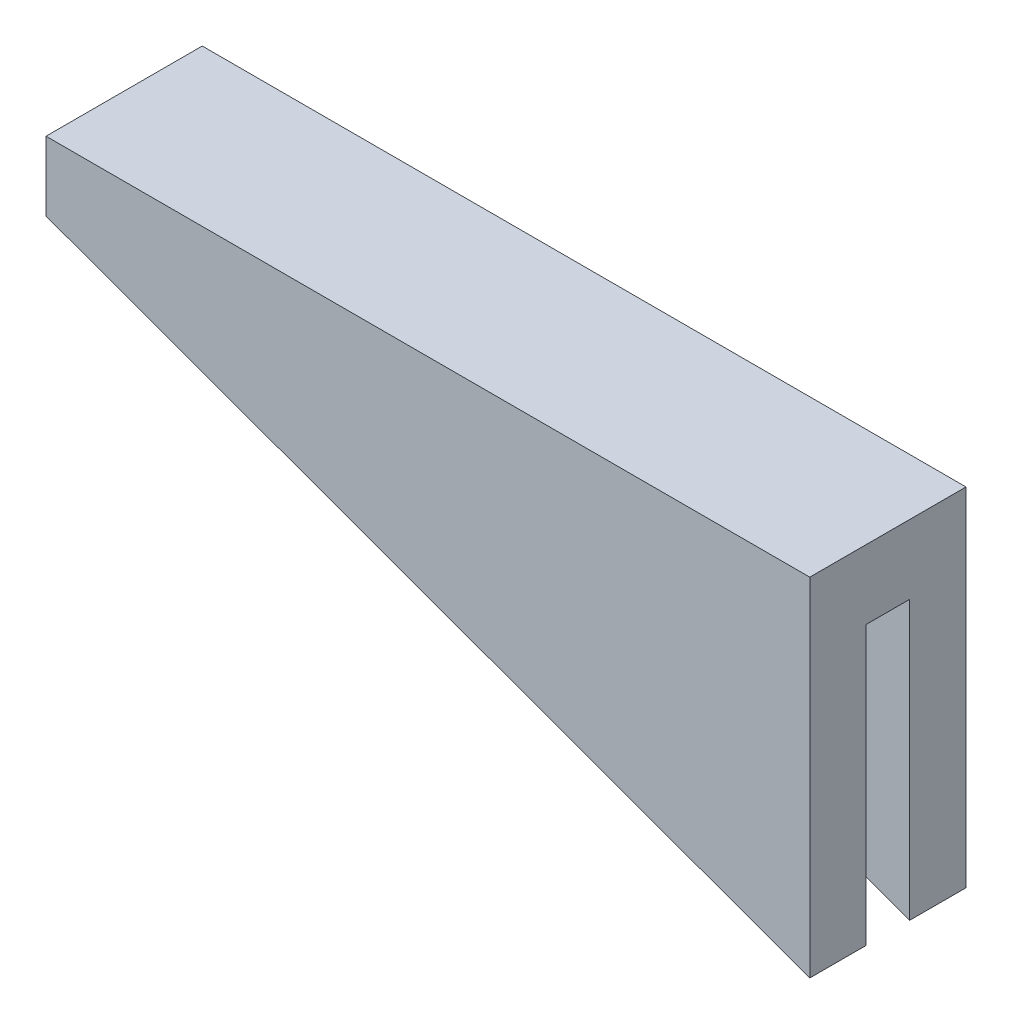
ISO-10303-21;
HEADER;
FILE_DESCRIPTION(('STEP AP214'),'2;1');
FILE_NAME('part.step','',(''),(''),'','','');
FILE_SCHEMA(('AUTOMOTIVE_DESIGN { 1 0 10303 214 1 1 1 1 }'));
ENDSEC;
DATA;
#1=APPLICATION_CONTEXT('core data for automotive mechanical design processes');
#2=APPLICATION_PROTOCOL_DEFINITION('international standard','automotive_design',2000,#1);
#3=PRODUCT_CONTEXT('',#1,'mechanical');
#4=PRODUCT('Part','Part','',(#3));
#5=PRODUCT_RELATED_PRODUCT_CATEGORY('part','',(#4));
#6=PRODUCT_DEFINITION_FORMATION('','',#4);
#7=PRODUCT_DEFINITION_CONTEXT('part definition',#1,'design');
#8=PRODUCT_DEFINITION('design','',#6,#7);
#9=PRODUCT_DEFINITION_SHAPE('','',#8);
#10=(LENGTH_UNIT() NAMED_UNIT(*) SI_UNIT(.MILLI.,.METRE.));
#11=(NAMED_UNIT(*) PLANE_ANGLE_UNIT() SI_UNIT($,.RADIAN.));
#12=(NAMED_UNIT(*) SI_UNIT($,.STERADIAN.) SOLID_ANGLE_UNIT());
#13=UNCERTAINTY_MEASURE_WITH_UNIT(LENGTH_MEASURE(1.E-05),#10,'distance_accuracy_value','');
#14=(GEOMETRIC_REPRESENTATION_CONTEXT(3) GLOBAL_UNCERTAINTY_ASSIGNED_CONTEXT((#13)) GLOBAL_UNIT_ASSIGNED_CONTEXT((#10,
#11,#12)) REPRESENTATION_CONTEXT('',''));
#15=CARTESIAN_POINT('',(0.,0.,0.));
#16=DIRECTION('',(0.,0.,1.));
#17=DIRECTION('',(1.,0.,0.));
#18=AXIS2_PLACEMENT_3D('',#15,#16,#17);
#19=CARTESIAN_POINT('',(88.,-40.,18.));
#20=DIRECTION('',(0.342020143325663,0.93969262078591,0.));
#21=DIRECTION('',(-0.939692620785911,0.342020143325663,0.));
#22=AXIS2_PLACEMENT_3D('',#19,#20,#21);
#23=PLANE('',#22);
#24=DIRECTION('',(0.,0.,-1.));
#25=VECTOR('',#24,1.);
#26=CARTESIAN_POINT('',(88.,-40.,18.));
#27=LINE('',#26,#25);
#28=CARTESIAN_POINT('',(88.,-40.,6.5));
#29=VERTEX_POINT('',#28);
#30=CARTESIAN_POINT('',(88.,-40.,0.));
#31=VERTEX_POINT('',#30);
#32=EDGE_CURVE('E175',#29,#31,#27,.T.);
#33=ORIENTED_EDGE('',*,*,#32,.F.);
#34=DIRECTION('',(-0.939692620785911,0.342020143325663,0.));
#35=VECTOR('',#34,1.);
#36=CARTESIAN_POINT('',(88.,-40.,6.5));
#37=LINE('',#36,#35);
#38=CARTESIAN_POINT('',(0.,-7.97061938457481,6.5));
#39=VERTEX_POINT('',#38);
#40=EDGE_CURVE('E142',#29,#39,#37,.T.);
#41=ORIENTED_EDGE('',*,*,#40,.T.);
#42=DIRECTION('',(0.,0.,-1.));
#43=VECTOR('',#42,1.);
#44=CARTESIAN_POINT('',(0.,-7.97061938457481,18.));
#45=LINE('',#44,#43);
#46=CARTESIAN_POINT('',(0.,-7.97061938457481,0.));
#47=VERTEX_POINT('',#46);
#48=EDGE_CURVE('E177',#39,#47,#45,.T.);
#49=ORIENTED_EDGE('',*,*,#48,.T.);
#50=DIRECTION('',(0.93969262078591,-0.342020143325663,0.));
#51=VECTOR('',#50,1.);
#52=CARTESIAN_POINT('',(88.,-40.,0.));
#53=LINE('',#52,#51);
#54=EDGE_CURVE('E161',#47,#31,#53,.T.);
#55=ORIENTED_EDGE('',*,*,#54,.T.);
#56=EDGE_LOOP('',(#33,#41,#49,#55));
#57=FACE_BOUND('',#56,.T.);
#58=ADVANCED_FACE('F43',(#57),#23,.F.);
#59=CARTESIAN_POINT('',(0.,-7.97061938457481,18.));
#60=DIRECTION('',(1.,0.,0.));
#61=DIRECTION('',(0.,0.,-1.));
#62=AXIS2_PLACEMENT_3D('',#59,#60,#61);
#63=PLANE('',#62);
#64=DIRECTION('',(0.,-1.,0.));
#65=VECTOR('',#64,1.);
#66=CARTESIAN_POINT('',(0.,-7.97061938457481,0.));
#67=LINE('',#66,#65);
#68=CARTESIAN_POINT('',(0.,0.,0.));
#69=VERTEX_POINT('',#68);
#70=EDGE_CURVE('E146',#69,#47,#67,.T.);
#71=ORIENTED_EDGE('',*,*,#70,.T.);
#72=ORIENTED_EDGE('',*,*,#48,.F.);
#73=DIRECTION('',(0.,0.,1.));
#74=VECTOR('',#73,1.);
#75=CARTESIAN_POINT('',(0.,-7.97061938457481,18.));
#76=LINE('',#75,#74);
#77=CARTESIAN_POINT('',(0.,-7.97061938457481,11.5));
#78=VERTEX_POINT('',#77);
#79=EDGE_CURVE('E121',#39,#78,#76,.T.);
#80=ORIENTED_EDGE('',*,*,#79,.T.);
#81=CARTESIAN_POINT('',(0.,-7.97061938457481,18.));
#82=VERTEX_POINT('',#81);
#83=EDGE_CURVE('E52',#82,#78,#45,.T.);
#84=ORIENTED_EDGE('',*,*,#83,.F.);
#85=DIRECTION('',(0.,-1.,0.));
#86=VECTOR('',#85,1.);
#87=CARTESIAN_POINT('',(0.,-7.97061938457481,18.));
#88=LINE('',#87,#86);
#89=CARTESIAN_POINT('',(0.,0.,18.));
#90=VERTEX_POINT('',#89);
#91=EDGE_CURVE('E147',#90,#82,#88,.T.);
#92=ORIENTED_EDGE('',*,*,#91,.F.);
#93=DIRECTION('',(0.,0.,-1.));
#94=VECTOR('',#93,1.);
#95=CARTESIAN_POINT('',(0.,0.,18.));
#96=LINE('',#95,#94);
#97=EDGE_CURVE('E157',#90,#69,#96,.T.);
#98=ORIENTED_EDGE('',*,*,#97,.T.);
#99=EDGE_LOOP('',(#71,#72,#80,#84,#92,#98));
#100=FACE_BOUND('',#99,.T.);
#101=ADVANCED_FACE('F45',(#100),#63,.F.);
#102=ORIENTED_EDGE('',*,*,#83,.T.);
#103=DIRECTION('',(0.939692620785911,-0.342020143325663,0.));
#104=VECTOR('',#103,1.);
#105=CARTESIAN_POINT('',(88.,-40.,11.5));
#106=LINE('',#105,#104);
#107=CARTESIAN_POINT('',(88.,-40.,11.5));
#108=VERTEX_POINT('',#107);
#109=EDGE_CURVE('E118',#78,#108,#106,.T.);
#110=ORIENTED_EDGE('',*,*,#109,.T.);
#111=CARTESIAN_POINT('',(88.,-40.,18.));
#112=VERTEX_POINT('',#111);
#113=EDGE_CURVE('E132',#112,#108,#27,.T.);
#114=ORIENTED_EDGE('',*,*,#113,.F.);
#115=DIRECTION('',(0.93969262078591,-0.342020143325663,0.));
#116=VECTOR('',#115,1.);
#117=CARTESIAN_POINT('',(88.,-40.,18.));
#118=LINE('',#117,#116);
#119=EDGE_CURVE('E97',#82,#112,#118,.T.);
#120=ORIENTED_EDGE('',*,*,#119,.F.);
#121=EDGE_LOOP('',(#102,#110,#114,#120));
#122=FACE_BOUND('',#121,.T.);
#123=ADVANCED_FACE('F208',(#122),#23,.F.);
#124=CARTESIAN_POINT('',(88.,0.,18.));
#125=DIRECTION('',(-1.,0.,0.));
#126=DIRECTION('',(0.,0.,1.));
#127=AXIS2_PLACEMENT_3D('',#124,#125,#126);
#128=PLANE('',#127);
#129=DIRECTION('',(0.,0.,1.));
#130=VECTOR('',#129,1.);
#131=CARTESIAN_POINT('',(88.,-7.97061938457481,11.5));
#132=LINE('',#131,#130);
#133=CARTESIAN_POINT('',(88.,-7.97061938457481,6.5));
#134=VERTEX_POINT('',#133);
#135=CARTESIAN_POINT('',(88.,-7.97061938457481,11.5));
#136=VERTEX_POINT('',#135);
#137=EDGE_CURVE('E124',#134,#136,#132,.T.);
#138=ORIENTED_EDGE('',*,*,#137,.F.);
#139=DIRECTION('',(0.,-1.,0.));
#140=VECTOR('',#139,1.);
#141=CARTESIAN_POINT('',(88.,0.,6.5));
#142=LINE('',#141,#140);
#143=EDGE_CURVE('E11',#134,#29,#142,.T.);
#144=ORIENTED_EDGE('',*,*,#143,.T.);
#145=ORIENTED_EDGE('',*,*,#32,.T.);
#146=DIRECTION('',(0.,1.,0.));
#147=VECTOR('',#146,1.);
#148=CARTESIAN_POINT('',(88.,0.,0.));
#149=LINE('',#148,#147);
#150=CARTESIAN_POINT('',(88.,0.,0.));
#151=VERTEX_POINT('',#150);
#152=EDGE_CURVE('E165',#31,#151,#149,.T.);
#153=ORIENTED_EDGE('',*,*,#152,.T.);
#154=DIRECTION('',(0.,0.,-1.));
#155=VECTOR('',#154,1.);
#156=CARTESIAN_POINT('',(88.,0.,18.));
#157=LINE('',#156,#155);
#158=CARTESIAN_POINT('',(88.,0.,18.));
#159=VERTEX_POINT('',#158);
#160=EDGE_CURVE('E172',#159,#151,#157,.T.);
#161=ORIENTED_EDGE('',*,*,#160,.F.);
#162=DIRECTION('',(0.,1.,0.));
#163=VECTOR('',#162,1.);
#164=CARTESIAN_POINT('',(88.,0.,18.));
#165=LINE('',#164,#163);
#166=EDGE_CURVE('E152',#112,#159,#165,.T.);
#167=ORIENTED_EDGE('',*,*,#166,.F.);
#168=ORIENTED_EDGE('',*,*,#113,.T.);
#169=DIRECTION('',(0.,-1.,0.));
#170=VECTOR('',#169,1.);
#171=CARTESIAN_POINT('',(88.,-72.0293806154252,11.5));
#172=LINE('',#171,#170);
#173=EDGE_CURVE('E116',#136,#108,#172,.T.);
#174=ORIENTED_EDGE('',*,*,#173,.F.);
#175=EDGE_LOOP('',(#138,#144,#145,#153,#161,#167,#168,#174));
#176=FACE_BOUND('',#175,.T.);
#177=ADVANCED_FACE('F130',(#176),#128,.F.);
#178=CARTESIAN_POINT('',(0.,0.,18.));
#179=DIRECTION('',(0.,-1.,0.));
#180=DIRECTION('',(0.,0.,-1.));
#181=AXIS2_PLACEMENT_3D('',#178,#179,#180);
#182=PLANE('',#181);
#183=DIRECTION('',(-1.,0.,0.));
#184=VECTOR('',#183,1.);
#185=CARTESIAN_POINT('',(0.,0.,0.));
#186=LINE('',#185,#184);
#187=EDGE_CURVE('E89',#151,#69,#186,.T.);
#188=ORIENTED_EDGE('',*,*,#187,.T.);
#189=ORIENTED_EDGE('',*,*,#97,.F.);
#190=DIRECTION('',(-1.,0.,0.));
#191=VECTOR('',#190,1.);
#192=CARTESIAN_POINT('',(0.,0.,18.));
#193=LINE('',#192,#191);
#194=EDGE_CURVE('E68',#159,#90,#193,.T.);
#195=ORIENTED_EDGE('',*,*,#194,.F.);
#196=ORIENTED_EDGE('',*,*,#160,.T.);
#197=EDGE_LOOP('',(#188,#189,#195,#196));
#198=FACE_BOUND('',#197,.T.);
#199=ADVANCED_FACE('F191',(#198),#182,.F.);
#200=CARTESIAN_POINT('',(0.,0.,18.));
#201=DIRECTION('',(0.,0.,-1.));
#202=DIRECTION('',(-1.,0.,0.));
#203=AXIS2_PLACEMENT_3D('',#200,#201,#202);
#204=PLANE('',#203);
#205=ORIENTED_EDGE('',*,*,#91,.T.);
#206=ORIENTED_EDGE('',*,*,#119,.T.);
#207=ORIENTED_EDGE('',*,*,#166,.T.);
#208=ORIENTED_EDGE('',*,*,#194,.T.);
#209=EDGE_LOOP('',(#205,#206,#207,#208));
#210=FACE_BOUND('',#209,.T.);
#211=ADVANCED_FACE('F203',(#210),#204,.F.);
#212=CARTESIAN_POINT('',(0.,0.,0.));
#213=DIRECTION('',(0.,0.,-1.));
#214=DIRECTION('',(-1.,0.,0.));
#215=AXIS2_PLACEMENT_3D('',#212,#213,#214);
#216=PLANE('',#215);
#217=ORIENTED_EDGE('',*,*,#70,.F.);
#218=ORIENTED_EDGE('',*,*,#187,.F.);
#219=ORIENTED_EDGE('',*,*,#152,.F.);
#220=ORIENTED_EDGE('',*,*,#54,.F.);
#221=EDGE_LOOP('',(#217,#218,#219,#220));
#222=FACE_BOUND('',#221,.T.);
#223=ADVANCED_FACE('F189',(#222),#216,.T.);
#224=CARTESIAN_POINT('',(-23.0000000000001,-72.0293806154252,6.5));
#225=DIRECTION('',(0.,0.,-1.));
#226=DIRECTION('',(0.,1.,0.));
#227=AXIS2_PLACEMENT_3D('',#224,#225,#226);
#228=PLANE('',#227);
#229=ORIENTED_EDGE('',*,*,#143,.F.);
#230=DIRECTION('',(1.,0.,0.));
#231=VECTOR('',#230,1.);
#232=CARTESIAN_POINT('',(-23.0000000000001,-7.97061938457481,6.5));
#233=LINE('',#232,#231);
#234=EDGE_CURVE('E59',#39,#134,#233,.T.);
#235=ORIENTED_EDGE('',*,*,#234,.F.);
#236=ORIENTED_EDGE('',*,*,#40,.F.);
#237=EDGE_LOOP('',(#229,#235,#236));
#238=FACE_BOUND('',#237,.T.);
#239=ADVANCED_FACE('F195',(#238),#228,.F.);
#240=CARTESIAN_POINT('',(-23.0000000000001,-72.0293806154252,11.5));
#241=DIRECTION('',(0.,0.,1.));
#242=DIRECTION('',(0.,-1.,0.));
#243=AXIS2_PLACEMENT_3D('',#240,#241,#242);
#244=PLANE('',#243);
#245=DIRECTION('',(1.,0.,0.));
#246=VECTOR('',#245,1.);
#247=CARTESIAN_POINT('',(-23.0000000000001,-7.97061938457481,11.5));
#248=LINE('',#247,#246);
#249=EDGE_CURVE('E113',#78,#136,#248,.T.);
#250=ORIENTED_EDGE('',*,*,#249,.T.);
#251=ORIENTED_EDGE('',*,*,#173,.T.);
#252=ORIENTED_EDGE('',*,*,#109,.F.);
#253=EDGE_LOOP('',(#250,#251,#252));
#254=FACE_BOUND('',#253,.T.);
#255=ADVANCED_FACE('F114',(#254),#244,.F.);
#256=CARTESIAN_POINT('',(-23.0000000000001,-7.97061938457481,11.5));
#257=DIRECTION('',(0.,1.,0.));
#258=DIRECTION('',(0.,0.,1.));
#259=AXIS2_PLACEMENT_3D('',#256,#257,#258);
#260=PLANE('',#259);
#261=ORIENTED_EDGE('',*,*,#234,.T.);
#262=ORIENTED_EDGE('',*,*,#137,.T.);
#263=ORIENTED_EDGE('',*,*,#249,.F.);
#264=ORIENTED_EDGE('',*,*,#79,.F.);
#265=EDGE_LOOP('',(#261,#262,#263,#264));
#266=FACE_BOUND('',#265,.T.);
#267=ADVANCED_FACE('F125',(#266),#260,.F.);
#268=CLOSED_SHELL('',(#58,#101,#123,#177,#199,#211,#223,#239,#255,#267));
#269=MANIFOLD_SOLID_BREP('B2',#268);
#270=ADVANCED_BREP_SHAPE_REPRESENTATION('',(#18,#269),#14);
#271=SHAPE_DEFINITION_REPRESENTATION(#9,#270);
ENDSEC;
END-ISO-10303-21;
